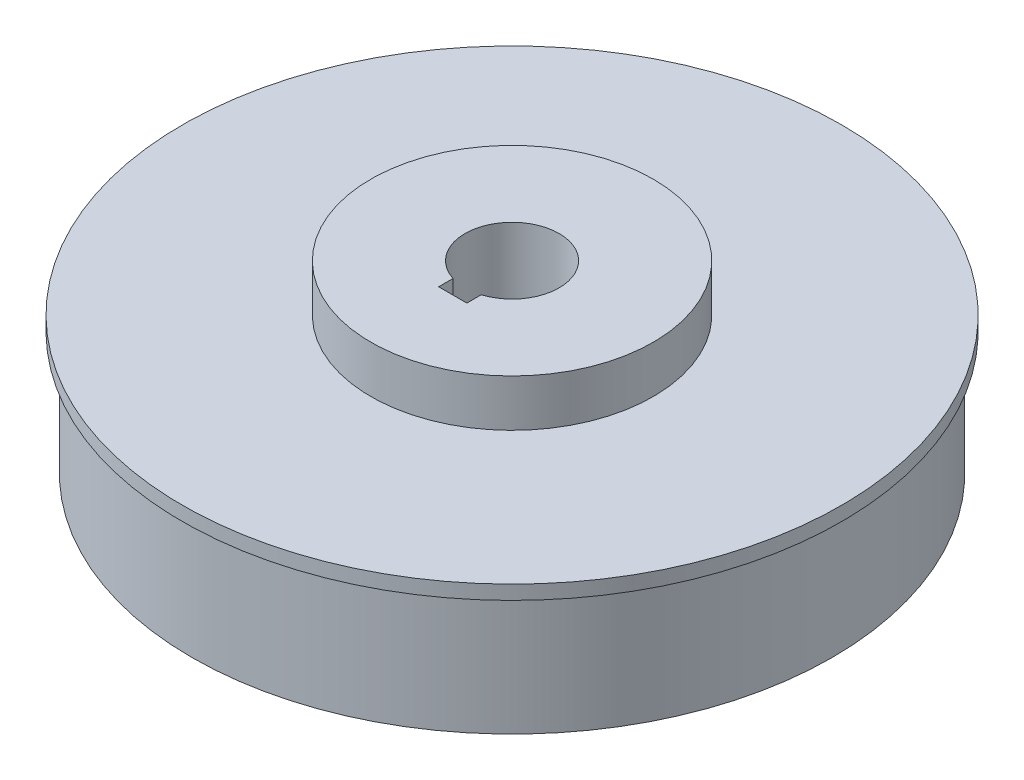
ISO-10303-21;
HEADER;
FILE_DESCRIPTION(('STEP AP214'),'2;1');
FILE_NAME('part.step','',(''),(''),'','','');
FILE_SCHEMA(('AUTOMOTIVE_DESIGN { 1 0 10303 214 1 1 1 1 }'));
ENDSEC;
DATA;
#1=APPLICATION_CONTEXT('core data for automotive mechanical design processes');
#2=APPLICATION_PROTOCOL_DEFINITION('international standard','automotive_design',2000,#1);
#3=PRODUCT_CONTEXT('',#1,'mechanical');
#4=PRODUCT('Part','Part','',(#3));
#5=PRODUCT_RELATED_PRODUCT_CATEGORY('part','',(#4));
#6=PRODUCT_DEFINITION_FORMATION('','',#4);
#7=PRODUCT_DEFINITION_CONTEXT('part definition',#1,'design');
#8=PRODUCT_DEFINITION('design','',#6,#7);
#9=PRODUCT_DEFINITION_SHAPE('','',#8);
#10=(LENGTH_UNIT() NAMED_UNIT(*) SI_UNIT(.MILLI.,.METRE.));
#11=(NAMED_UNIT(*) PLANE_ANGLE_UNIT() SI_UNIT($,.RADIAN.));
#12=(NAMED_UNIT(*) SI_UNIT($,.STERADIAN.) SOLID_ANGLE_UNIT());
#13=UNCERTAINTY_MEASURE_WITH_UNIT(LENGTH_MEASURE(1.E-05),#10,'distance_accuracy_value','');
#14=(GEOMETRIC_REPRESENTATION_CONTEXT(3) GLOBAL_UNCERTAINTY_ASSIGNED_CONTEXT((#13)) GLOBAL_UNIT_ASSIGNED_CONTEXT((#10,
#11,#12)) REPRESENTATION_CONTEXT('',''));
#15=CARTESIAN_POINT('',(0.,0.,0.));
#16=DIRECTION('',(0.,0.,1.));
#17=DIRECTION('',(1.,0.,0.));
#18=AXIS2_PLACEMENT_3D('',#15,#16,#17);
#19=CARTESIAN_POINT('',(24.,0.,0.));
#20=DIRECTION('',(0.,-1.,0.));
#21=DIRECTION('',(0.,0.,-1.));
#22=AXIS2_PLACEMENT_3D('',#19,#20,#21);
#23=PLANE('',#22);
#24=DIRECTION('',(0.,0.,-1.));
#25=VECTOR('',#24,1.);
#26=CARTESIAN_POINT('',(1.5,0.,4.3));
#27=LINE('',#26,#25);
#28=CARTESIAN_POINT('',(1.5,0.,6.3));
#29=VERTEX_POINT('',#28);
#30=CARTESIAN_POINT('',(1.5,0.,4.76969600708473));
#31=VERTEX_POINT('',#30);
#32=EDGE_CURVE('E89',#29,#31,#27,.T.);
#33=ORIENTED_EDGE('',*,*,#32,.T.);
#34=CARTESIAN_POINT('',(0.,0.,0.));
#35=DIRECTION('',(0.,1.,0.));
#36=DIRECTION('',(0.,0.,1.));
#37=AXIS2_PLACEMENT_3D('',#34,#35,#36);
#38=CIRCLE('',#37,5.);
#39=CARTESIAN_POINT('',(-1.5,0.,4.76969600708473));
#40=VERTEX_POINT('',#39);
#41=EDGE_CURVE('E88',#31,#40,#38,.T.);
#42=ORIENTED_EDGE('',*,*,#41,.T.);
#43=DIRECTION('',(0.,0.,1.));
#44=VECTOR('',#43,1.);
#45=CARTESIAN_POINT('',(-1.5,0.,4.3));
#46=LINE('',#45,#44);
#47=CARTESIAN_POINT('',(-1.5,0.,6.3));
#48=VERTEX_POINT('',#47);
#49=EDGE_CURVE('E47',#40,#48,#46,.T.);
#50=ORIENTED_EDGE('',*,*,#49,.T.);
#51=DIRECTION('',(1.,0.,0.));
#52=VECTOR('',#51,1.);
#53=CARTESIAN_POINT('',(-1.5,0.,6.3));
#54=LINE('',#53,#52);
#55=EDGE_CURVE('E79',#48,#29,#54,.T.);
#56=ORIENTED_EDGE('',*,*,#55,.T.);
#57=EDGE_LOOP('',(#33,#42,#50,#56));
#58=FACE_BOUND('',#57,.T.);
#59=CARTESIAN_POINT('',(0.,0.,0.));
#60=DIRECTION('',(0.,-1.,0.));
#61=DIRECTION('',(0.,0.,-1.));
#62=AXIS2_PLACEMENT_3D('',#59,#60,#61);
#63=CIRCLE('',#62,24.);
#64=CARTESIAN_POINT('',(0.,0.,-24.));
#65=VERTEX_POINT('',#64);
#66=EDGE_CURVE('E101',#65,#65,#63,.T.);
#67=ORIENTED_EDGE('',*,*,#66,.T.);
#68=EDGE_LOOP('',(#67));
#69=FACE_BOUND('',#68,.T.);
#70=ADVANCED_FACE('F33',(#58,#69),#23,.T.);
#71=CARTESIAN_POINT('',(15.,21.,0.));
#72=DIRECTION('',(0.,1.,0.));
#73=DIRECTION('',(0.,0.,1.));
#74=AXIS2_PLACEMENT_3D('',#71,#72,#73);
#75=PLANE('',#74);
#76=DIRECTION('',(0.,0.,-1.));
#77=VECTOR('',#76,1.);
#78=CARTESIAN_POINT('',(1.5,21.,4.3));
#79=LINE('',#78,#77);
#80=CARTESIAN_POINT('',(1.5,21.,6.3));
#81=VERTEX_POINT('',#80);
#82=CARTESIAN_POINT('',(1.5,21.,4.76969600708473));
#83=VERTEX_POINT('',#82);
#84=EDGE_CURVE('E94',#81,#83,#79,.T.);
#85=ORIENTED_EDGE('',*,*,#84,.F.);
#86=DIRECTION('',(1.,0.,0.));
#87=VECTOR('',#86,1.);
#88=CARTESIAN_POINT('',(-1.5,21.,6.3));
#89=LINE('',#88,#87);
#90=CARTESIAN_POINT('',(-1.5,21.,6.3));
#91=VERTEX_POINT('',#90);
#92=EDGE_CURVE('E91',#91,#81,#89,.T.);
#93=ORIENTED_EDGE('',*,*,#92,.F.);
#94=DIRECTION('',(0.,0.,1.));
#95=VECTOR('',#94,1.);
#96=CARTESIAN_POINT('',(-1.5,21.,4.3));
#97=LINE('',#96,#95);
#98=CARTESIAN_POINT('',(-1.5,21.,4.76969600708473));
#99=VERTEX_POINT('',#98);
#100=EDGE_CURVE('E74',#99,#91,#97,.T.);
#101=ORIENTED_EDGE('',*,*,#100,.F.);
#102=CARTESIAN_POINT('',(0.,21.,0.));
#103=DIRECTION('',(0.,1.,0.));
#104=DIRECTION('',(0.,0.,1.));
#105=AXIS2_PLACEMENT_3D('',#102,#103,#104);
#106=CIRCLE('',#105,5.);
#107=EDGE_CURVE('E98',#83,#99,#106,.T.);
#108=ORIENTED_EDGE('',*,*,#107,.F.);
#109=EDGE_LOOP('',(#85,#93,#101,#108));
#110=FACE_BOUND('',#109,.T.);
#111=CARTESIAN_POINT('',(0.,21.,0.));
#112=DIRECTION('',(0.,-1.,0.));
#113=DIRECTION('',(0.,0.,-1.));
#114=AXIS2_PLACEMENT_3D('',#111,#112,#113);
#115=CIRCLE('',#114,15.);
#116=CARTESIAN_POINT('',(0.,21.,-15.));
#117=VERTEX_POINT('',#116);
#118=EDGE_CURVE('E124',#117,#117,#115,.T.);
#119=ORIENTED_EDGE('',*,*,#118,.F.);
#120=EDGE_LOOP('',(#119));
#121=FACE_BOUND('',#120,.T.);
#122=ADVANCED_FACE('F131',(#110,#121),#75,.T.);
#123=CARTESIAN_POINT('',(0.,0.,0.));
#124=DIRECTION('',(0.,-1.,0.));
#125=DIRECTION('',(0.,0.,-1.));
#126=AXIS2_PLACEMENT_3D('',#123,#124,#125);
#127=CYLINDRICAL_SURFACE('',#126,15.);
#128=ORIENTED_EDGE('',*,*,#118,.T.);
#129=EDGE_LOOP('',(#128));
#130=FACE_BOUND('',#129,.T.);
#131=CARTESIAN_POINT('',(0.,16.,0.));
#132=DIRECTION('',(0.,-1.,0.));
#133=DIRECTION('',(0.,0.,-1.));
#134=AXIS2_PLACEMENT_3D('',#131,#132,#133);
#135=CIRCLE('',#134,15.);
#136=CARTESIAN_POINT('',(0.,16.,-15.));
#137=VERTEX_POINT('',#136);
#138=EDGE_CURVE('E121',#137,#137,#135,.T.);
#139=ORIENTED_EDGE('',*,*,#138,.F.);
#140=EDGE_LOOP('',(#139));
#141=FACE_BOUND('',#140,.T.);
#142=ADVANCED_FACE('F147',(#130,#141),#127,.T.);
#143=CARTESIAN_POINT('',(35.,16.,0.));
#144=DIRECTION('',(0.,1.,0.));
#145=DIRECTION('',(0.,0.,1.));
#146=AXIS2_PLACEMENT_3D('',#143,#144,#145);
#147=PLANE('',#146);
#148=ORIENTED_EDGE('',*,*,#138,.T.);
#149=EDGE_LOOP('',(#148));
#150=FACE_BOUND('',#149,.T.);
#151=CARTESIAN_POINT('',(0.,16.,0.));
#152=DIRECTION('',(0.,-1.,0.));
#153=DIRECTION('',(0.,0.,-1.));
#154=AXIS2_PLACEMENT_3D('',#151,#152,#153);
#155=CIRCLE('',#154,35.);
#156=CARTESIAN_POINT('',(0.,16.,-35.));
#157=VERTEX_POINT('',#156);
#158=EDGE_CURVE('E118',#157,#157,#155,.T.);
#159=ORIENTED_EDGE('',*,*,#158,.F.);
#160=EDGE_LOOP('',(#159));
#161=FACE_BOUND('',#160,.T.);
#162=ADVANCED_FACE('F151',(#150,#161),#147,.T.);
#163=CARTESIAN_POINT('',(0.,0.,0.));
#164=DIRECTION('',(0.,-1.,0.));
#165=DIRECTION('',(0.,0.,-1.));
#166=AXIS2_PLACEMENT_3D('',#163,#164,#165);
#167=CYLINDRICAL_SURFACE('',#166,35.);
#168=ORIENTED_EDGE('',*,*,#158,.T.);
#169=EDGE_LOOP('',(#168));
#170=FACE_BOUND('',#169,.T.);
#171=CARTESIAN_POINT('',(0.,14.5,0.));
#172=DIRECTION('',(0.,-1.,0.));
#173=DIRECTION('',(0.,0.,-1.));
#174=AXIS2_PLACEMENT_3D('',#171,#172,#173);
#175=CIRCLE('',#174,35.);
#176=CARTESIAN_POINT('',(0.,14.5,-35.));
#177=VERTEX_POINT('',#176);
#178=EDGE_CURVE('E115',#177,#177,#175,.T.);
#179=ORIENTED_EDGE('',*,*,#178,.F.);
#180=EDGE_LOOP('',(#179));
#181=FACE_BOUND('',#180,.T.);
#182=ADVANCED_FACE('F157',(#170,#181),#167,.T.);
#183=CARTESIAN_POINT('',(34.,14.5,0.));
#184=DIRECTION('',(0.,-1.,0.));
#185=DIRECTION('',(0.,0.,-1.));
#186=AXIS2_PLACEMENT_3D('',#183,#184,#185);
#187=PLANE('',#186);
#188=ORIENTED_EDGE('',*,*,#178,.T.);
#189=EDGE_LOOP('',(#188));
#190=FACE_BOUND('',#189,.T.);
#191=CARTESIAN_POINT('',(0.,14.5,0.));
#192=DIRECTION('',(0.,-1.,0.));
#193=DIRECTION('',(0.,0.,-1.));
#194=AXIS2_PLACEMENT_3D('',#191,#192,#193);
#195=CIRCLE('',#194,34.);
#196=CARTESIAN_POINT('',(0.,14.5,-34.));
#197=VERTEX_POINT('',#196);
#198=EDGE_CURVE('E112',#197,#197,#195,.T.);
#199=ORIENTED_EDGE('',*,*,#198,.F.);
#200=EDGE_LOOP('',(#199));
#201=FACE_BOUND('',#200,.T.);
#202=ADVANCED_FACE('F161',(#190,#201),#187,.T.);
#203=CARTESIAN_POINT('',(0.,0.,0.));
#204=DIRECTION('',(0.,-1.,0.));
#205=DIRECTION('',(0.,0.,-1.));
#206=AXIS2_PLACEMENT_3D('',#203,#204,#205);
#207=CYLINDRICAL_SURFACE('',#206,34.);
#208=ORIENTED_EDGE('',*,*,#198,.T.);
#209=EDGE_LOOP('',(#208));
#210=FACE_BOUND('',#209,.T.);
#211=CARTESIAN_POINT('',(0.,1.5,0.));
#212=DIRECTION('',(0.,-1.,0.));
#213=DIRECTION('',(0.,0.,-1.));
#214=AXIS2_PLACEMENT_3D('',#211,#212,#213);
#215=CIRCLE('',#214,34.);
#216=CARTESIAN_POINT('',(0.,1.5,-34.));
#217=VERTEX_POINT('',#216);
#218=EDGE_CURVE('E109',#217,#217,#215,.T.);
#219=ORIENTED_EDGE('',*,*,#218,.F.);
#220=EDGE_LOOP('',(#219));
#221=FACE_BOUND('',#220,.T.);
#222=ADVANCED_FACE('F165',(#210,#221),#207,.T.);
#223=CARTESIAN_POINT('',(34.,1.5,0.));
#224=DIRECTION('',(0.,-1.,0.));
#225=DIRECTION('',(0.,0.,-1.));
#226=AXIS2_PLACEMENT_3D('',#223,#224,#225);
#227=PLANE('',#226);
#228=ORIENTED_EDGE('',*,*,#218,.T.);
#229=EDGE_LOOP('',(#228));
#230=FACE_BOUND('',#229,.T.);
#231=CARTESIAN_POINT('',(0.,1.5,0.));
#232=DIRECTION('',(0.,-1.,0.));
#233=DIRECTION('',(0.,0.,-1.));
#234=AXIS2_PLACEMENT_3D('',#231,#232,#233);
#235=CIRCLE('',#234,24.);
#236=CARTESIAN_POINT('',(0.,1.5,-24.));
#237=VERTEX_POINT('',#236);
#238=EDGE_CURVE('E106',#237,#237,#235,.T.);
#239=ORIENTED_EDGE('',*,*,#238,.F.);
#240=EDGE_LOOP('',(#239));
#241=FACE_BOUND('',#240,.T.);
#242=ADVANCED_FACE('F169',(#230,#241),#227,.T.);
#243=CARTESIAN_POINT('',(0.,0.,0.));
#244=DIRECTION('',(0.,-1.,0.));
#245=DIRECTION('',(0.,0.,-1.));
#246=AXIS2_PLACEMENT_3D('',#243,#244,#245);
#247=CYLINDRICAL_SURFACE('',#246,24.);
#248=ORIENTED_EDGE('',*,*,#238,.T.);
#249=EDGE_LOOP('',(#248));
#250=FACE_BOUND('',#249,.T.);
#251=ORIENTED_EDGE('',*,*,#66,.F.);
#252=EDGE_LOOP('',(#251));
#253=FACE_BOUND('',#252,.T.);
#254=ADVANCED_FACE('F141',(#250,#253),#247,.T.);
#255=CARTESIAN_POINT('',(0.,0.,0.));
#256=DIRECTION('',(0.,1.,0.));
#257=DIRECTION('',(0.,0.,1.));
#258=AXIS2_PLACEMENT_3D('',#255,#256,#257);
#259=CYLINDRICAL_SURFACE('',#258,5.);
#260=ORIENTED_EDGE('',*,*,#41,.F.);
#261=DIRECTION('',(0.,1.,0.));
#262=VECTOR('',#261,1.);
#263=CARTESIAN_POINT('',(1.5,0.,4.76969600708473));
#264=LINE('',#263,#262);
#265=EDGE_CURVE('E11',#31,#83,#264,.T.);
#266=ORIENTED_EDGE('',*,*,#265,.T.);
#267=ORIENTED_EDGE('',*,*,#107,.T.);
#268=DIRECTION('',(0.,1.,0.));
#269=VECTOR('',#268,1.);
#270=CARTESIAN_POINT('',(-1.5,0.,4.76969600708473));
#271=LINE('',#270,#269);
#272=EDGE_CURVE('E40',#99,#40,#271,.F.);
#273=ORIENTED_EDGE('',*,*,#272,.T.);
#274=EDGE_LOOP('',(#260,#266,#267,#273));
#275=FACE_BOUND('',#274,.T.);
#276=ADVANCED_FACE('F127',(#275),#259,.F.);
#277=CARTESIAN_POINT('',(1.5,0.,4.3));
#278=DIRECTION('',(1.,0.,0.));
#279=DIRECTION('',(0.,0.,-1.));
#280=AXIS2_PLACEMENT_3D('',#277,#278,#279);
#281=PLANE('',#280);
#282=ORIENTED_EDGE('',*,*,#32,.F.);
#283=DIRECTION('',(0.,1.,0.));
#284=VECTOR('',#283,1.);
#285=CARTESIAN_POINT('',(1.5,0.,6.3));
#286=LINE('',#285,#284);
#287=EDGE_CURVE('E78',#29,#81,#286,.T.);
#288=ORIENTED_EDGE('',*,*,#287,.T.);
#289=ORIENTED_EDGE('',*,*,#84,.T.);
#290=ORIENTED_EDGE('',*,*,#265,.F.);
#291=EDGE_LOOP('',(#282,#288,#289,#290));
#292=FACE_BOUND('',#291,.T.);
#293=ADVANCED_FACE('F133',(#292),#281,.F.);
#294=CARTESIAN_POINT('',(-1.5,0.,4.3));
#295=DIRECTION('',(-1.,0.,0.));
#296=DIRECTION('',(0.,0.,1.));
#297=AXIS2_PLACEMENT_3D('',#294,#295,#296);
#298=PLANE('',#297);
#299=ORIENTED_EDGE('',*,*,#100,.T.);
#300=DIRECTION('',(0.,1.,0.));
#301=VECTOR('',#300,1.);
#302=CARTESIAN_POINT('',(-1.5,0.,6.3));
#303=LINE('',#302,#301);
#304=EDGE_CURVE('E70',#48,#91,#303,.T.);
#305=ORIENTED_EDGE('',*,*,#304,.F.);
#306=ORIENTED_EDGE('',*,*,#49,.F.);
#307=ORIENTED_EDGE('',*,*,#272,.F.);
#308=EDGE_LOOP('',(#299,#305,#306,#307));
#309=FACE_BOUND('',#308,.T.);
#310=ADVANCED_FACE('F72',(#309),#298,.F.);
#311=CARTESIAN_POINT('',(-1.5,0.,6.3));
#312=DIRECTION('',(0.,0.,1.));
#313=DIRECTION('',(1.,0.,0.));
#314=AXIS2_PLACEMENT_3D('',#311,#312,#313);
#315=PLANE('',#314);
#316=ORIENTED_EDGE('',*,*,#92,.T.);
#317=ORIENTED_EDGE('',*,*,#287,.F.);
#318=ORIENTED_EDGE('',*,*,#55,.F.);
#319=ORIENTED_EDGE('',*,*,#304,.T.);
#320=EDGE_LOOP('',(#316,#317,#318,#319));
#321=FACE_BOUND('',#320,.T.);
#322=ADVANCED_FACE('F82',(#321),#315,.F.);
#323=CLOSED_SHELL('',(#70,#122,#142,#162,#182,#202,#222,#242,#254,#276,#293,#310,#322));
#324=MANIFOLD_SOLID_BREP('B2',#323);
#325=ADVANCED_BREP_SHAPE_REPRESENTATION('',(#18,#324),#14);
#326=SHAPE_DEFINITION_REPRESENTATION(#9,#325);
ENDSEC;
END-ISO-10303-21;
